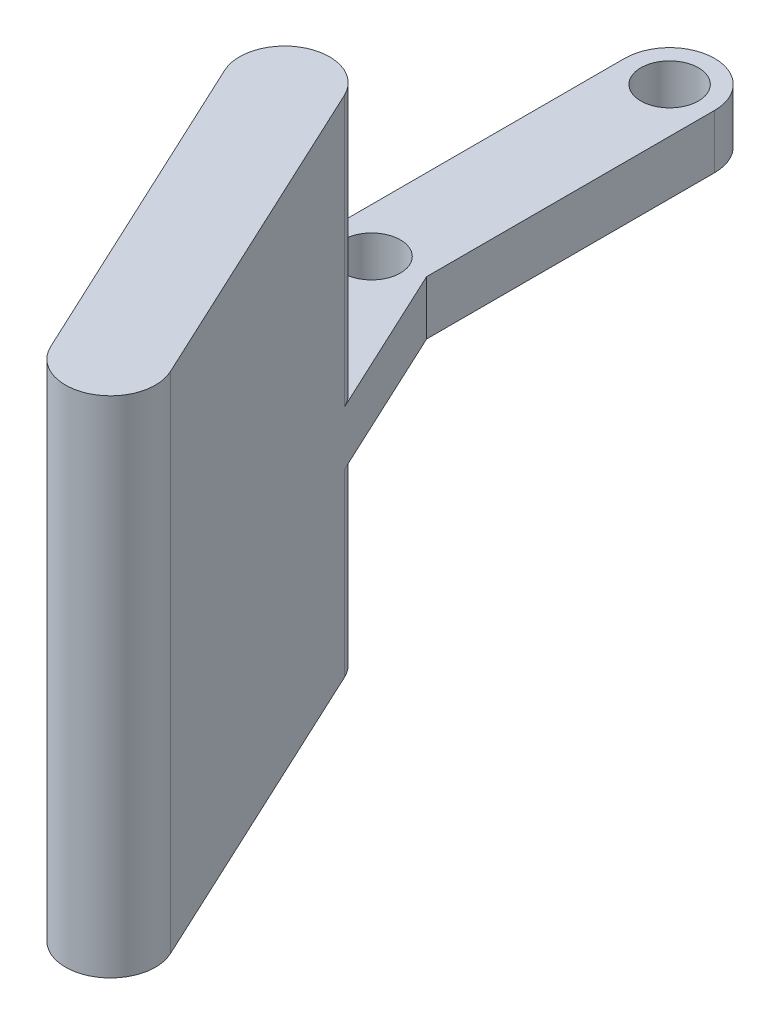
ISO-10303-21;
HEADER;
FILE_DESCRIPTION(('STEP AP214'),'2;1');
FILE_NAME('part.step','',(''),(''),'','','');
FILE_SCHEMA(('AUTOMOTIVE_DESIGN { 1 0 10303 214 1 1 1 1 }'));
ENDSEC;
DATA;
#1=APPLICATION_CONTEXT('core data for automotive mechanical design processes');
#2=APPLICATION_PROTOCOL_DEFINITION('international standard','automotive_design',2000,#1);
#3=PRODUCT_CONTEXT('',#1,'mechanical');
#4=PRODUCT('Part','Part','',(#3));
#5=PRODUCT_RELATED_PRODUCT_CATEGORY('part','',(#4));
#6=PRODUCT_DEFINITION_FORMATION('','',#4);
#7=PRODUCT_DEFINITION_CONTEXT('part definition',#1,'design');
#8=PRODUCT_DEFINITION('design','',#6,#7);
#9=PRODUCT_DEFINITION_SHAPE('','',#8);
#10=(LENGTH_UNIT() NAMED_UNIT(*) SI_UNIT(.MILLI.,.METRE.));
#11=(NAMED_UNIT(*) PLANE_ANGLE_UNIT() SI_UNIT($,.RADIAN.));
#12=(NAMED_UNIT(*) SI_UNIT($,.STERADIAN.) SOLID_ANGLE_UNIT());
#13=UNCERTAINTY_MEASURE_WITH_UNIT(LENGTH_MEASURE(1.E-05),#10,'distance_accuracy_value','');
#14=(GEOMETRIC_REPRESENTATION_CONTEXT(3) GLOBAL_UNCERTAINTY_ASSIGNED_CONTEXT((#13)) GLOBAL_UNIT_ASSIGNED_CONTEXT((#10,
#11,#12)) REPRESENTATION_CONTEXT('',''));
#15=CARTESIAN_POINT('',(0.,0.,0.));
#16=DIRECTION('',(0.,0.,1.));
#17=DIRECTION('',(1.,0.,0.));
#18=AXIS2_PLACEMENT_3D('',#15,#16,#17);
#19=CARTESIAN_POINT('',(0.,3.,16.5529453572468));
#20=DIRECTION('',(0.,-1.,0.));
#21=DIRECTION('',(0.,0.,-1.));
#22=AXIS2_PLACEMENT_3D('',#19,#20,#21);
#23=CYLINDRICAL_SURFACE('',#22,2.5);
#24=DIRECTION('',(0.,1.,0.));
#25=VECTOR('',#24,1.);
#26=CARTESIAN_POINT('',(-2.26545784998816,0.,17.6101590205747));
#27=LINE('',#26,#25);
#28=CARTESIAN_POINT('',(-2.26545784998816,0.,17.6101590205747));
#29=VERTEX_POINT('',#28);
#30=CARTESIAN_POINT('',(-2.26545784998816,3.,17.6101590205747));
#31=VERTEX_POINT('',#30);
#32=EDGE_CURVE('E219',#29,#31,#27,.T.);
#33=ORIENTED_EDGE('',*,*,#32,.T.);
#34=CARTESIAN_POINT('',(0.,3.,16.5529453572468));
#35=DIRECTION('',(0.,1.,0.));
#36=DIRECTION('',(0.,0.,1.));
#37=AXIS2_PLACEMENT_3D('',#34,#35,#36);
#38=CIRCLE('',#37,2.5);
#39=CARTESIAN_POINT('',(-2.5,3.,16.5529453572468));
#40=VERTEX_POINT('',#39);
#41=EDGE_CURVE('E241',#40,#31,#38,.T.);
#42=ORIENTED_EDGE('',*,*,#41,.F.);
#43=DIRECTION('',(0.,-1.,0.));
#44=VECTOR('',#43,1.);
#45=CARTESIAN_POINT('',(-2.5,3.,16.5529453572468));
#46=LINE('',#45,#44);
#47=CARTESIAN_POINT('',(-2.5,0.,16.5529453572468));
#48=VERTEX_POINT('',#47);
#49=EDGE_CURVE('E54',#40,#48,#46,.T.);
#50=ORIENTED_EDGE('',*,*,#49,.T.);
#51=CARTESIAN_POINT('',(0.,0.,16.5529453572468));
#52=DIRECTION('',(0.,1.,0.));
#53=DIRECTION('',(0.,0.,1.));
#54=AXIS2_PLACEMENT_3D('',#51,#52,#53);
#55=CIRCLE('',#54,2.5);
#56=EDGE_CURVE('E255',#48,#29,#55,.T.);
#57=ORIENTED_EDGE('',*,*,#56,.T.);
#58=EDGE_LOOP('',(#33,#42,#50,#57));
#59=FACE_BOUND('',#58,.T.);
#60=ADVANCED_FACE('F45',(#59),#23,.T.);
#61=CARTESIAN_POINT('',(0.,3.,0.));
#62=DIRECTION('',(0.,-1.,0.));
#63=DIRECTION('',(0.,0.,-1.));
#64=AXIS2_PLACEMENT_3D('',#61,#62,#63);
#65=CYLINDRICAL_SURFACE('',#64,2.5);
#66=CARTESIAN_POINT('',(0.,0.,0.));
#67=DIRECTION('',(0.,1.,0.));
#68=DIRECTION('',(0.,0.,1.));
#69=AXIS2_PLACEMENT_3D('',#66,#67,#68);
#70=CIRCLE('',#69,2.5);
#71=CARTESIAN_POINT('',(2.5,0.,0.));
#72=VERTEX_POINT('',#71);
#73=CARTESIAN_POINT('',(-2.5,0.,0.));
#74=VERTEX_POINT('',#73);
#75=EDGE_CURVE('E232',#72,#74,#70,.T.);
#76=ORIENTED_EDGE('',*,*,#75,.T.);
#77=DIRECTION('',(0.,-1.,0.));
#78=VECTOR('',#77,1.);
#79=CARTESIAN_POINT('',(-2.5,3.,0.));
#80=LINE('',#79,#78);
#81=CARTESIAN_POINT('',(-2.5,3.,0.));
#82=VERTEX_POINT('',#81);
#83=EDGE_CURVE('E11',#82,#74,#80,.T.);
#84=ORIENTED_EDGE('',*,*,#83,.F.);
#85=CARTESIAN_POINT('',(0.,3.,0.));
#86=DIRECTION('',(0.,1.,0.));
#87=DIRECTION('',(0.,0.,1.));
#88=AXIS2_PLACEMENT_3D('',#85,#86,#87);
#89=CIRCLE('',#88,2.5);
#90=CARTESIAN_POINT('',(2.5,3.,0.));
#91=VERTEX_POINT('',#90);
#92=EDGE_CURVE('E233',#91,#82,#89,.T.);
#93=ORIENTED_EDGE('',*,*,#92,.F.);
#94=DIRECTION('',(0.,-1.,0.));
#95=VECTOR('',#94,1.);
#96=CARTESIAN_POINT('',(2.5,3.,0.));
#97=LINE('',#96,#95);
#98=EDGE_CURVE('E248',#91,#72,#97,.T.);
#99=ORIENTED_EDGE('',*,*,#98,.T.);
#100=EDGE_LOOP('',(#76,#84,#93,#99));
#101=FACE_BOUND('',#100,.T.);
#102=ADVANCED_FACE('F47',(#101),#65,.T.);
#103=CARTESIAN_POINT('',(-2.5,3.,0.));
#104=DIRECTION('',(1.,0.,0.));
#105=DIRECTION('',(0.,0.,-1.));
#106=AXIS2_PLACEMENT_3D('',#103,#104,#105);
#107=PLANE('',#106);
#108=DIRECTION('',(0.,0.,1.));
#109=VECTOR('',#108,1.);
#110=CARTESIAN_POINT('',(-2.5,0.,0.));
#111=LINE('',#110,#109);
#112=EDGE_CURVE('E252',#74,#48,#111,.T.);
#113=ORIENTED_EDGE('',*,*,#112,.T.);
#114=ORIENTED_EDGE('',*,*,#49,.F.);
#115=DIRECTION('',(0.,0.,1.));
#116=VECTOR('',#115,1.);
#117=CARTESIAN_POINT('',(-2.5,3.,0.));
#118=LINE('',#117,#116);
#119=EDGE_CURVE('E237',#82,#40,#118,.T.);
#120=ORIENTED_EDGE('',*,*,#119,.F.);
#121=ORIENTED_EDGE('',*,*,#83,.T.);
#122=EDGE_LOOP('',(#113,#114,#120,#121));
#123=FACE_BOUND('',#122,.T.);
#124=ADVANCED_FACE('F302',(#123),#107,.F.);
#125=CARTESIAN_POINT('',(2.5,3.,0.));
#126=DIRECTION('',(-1.,0.,0.));
#127=DIRECTION('',(0.,0.,1.));
#128=AXIS2_PLACEMENT_3D('',#125,#126,#127);
#129=PLANE('',#128);
#130=DIRECTION('',(0.,0.,-1.));
#131=VECTOR('',#130,1.);
#132=CARTESIAN_POINT('',(2.5,3.,0.));
#133=LINE('',#132,#131);
#134=CARTESIAN_POINT('',(2.5,3.,15.998322015373));
#135=VERTEX_POINT('',#134);
#136=EDGE_CURVE('E245',#135,#91,#133,.T.);
#137=ORIENTED_EDGE('',*,*,#136,.F.);
#138=DIRECTION('',(0.,-1.,0.));
#139=VECTOR('',#138,1.);
#140=CARTESIAN_POINT('',(2.5,3.,15.998322015373));
#141=LINE('',#140,#139);
#142=CARTESIAN_POINT('',(2.5,0.,15.998322015373));
#143=VERTEX_POINT('',#142);
#144=EDGE_CURVE('E141',#135,#143,#141,.T.);
#145=ORIENTED_EDGE('',*,*,#144,.T.);
#146=DIRECTION('',(0.,0.,-1.));
#147=VECTOR('',#146,1.);
#148=CARTESIAN_POINT('',(2.5,0.,0.));
#149=LINE('',#148,#147);
#150=EDGE_CURVE('E238',#143,#72,#149,.T.);
#151=ORIENTED_EDGE('',*,*,#150,.T.);
#152=ORIENTED_EDGE('',*,*,#98,.F.);
#153=EDGE_LOOP('',(#137,#145,#151,#152));
#154=FACE_BOUND('',#153,.T.);
#155=ADVANCED_FACE('F305',(#154),#129,.F.);
#156=CARTESIAN_POINT('',(0.,3.,0.));
#157=DIRECTION('',(0.,1.,0.));
#158=DIRECTION('',(0.,0.,1.));
#159=AXIS2_PLACEMENT_3D('',#156,#157,#158);
#160=PLANE('',#159);
#161=CARTESIAN_POINT('',(4.22885465331121,3.,25.6147767571995));
#162=DIRECTION('',(0.,1.,0.));
#163=DIRECTION('',(0.,0.,1.));
#164=AXIS2_PLACEMENT_3D('',#161,#162,#163);
#165=CIRCLE('',#164,2.5);
#166=CARTESIAN_POINT('',(6.49431250329938,3.,24.5575630938717));
#167=VERTEX_POINT('',#166);
#168=CARTESIAN_POINT('',(1.96339680332305,3.,26.6719904205273));
#169=VERTEX_POINT('',#168);
#170=EDGE_CURVE('E61',#167,#169,#165,.T.);
#171=ORIENTED_EDGE('',*,*,#170,.F.);
#172=DIRECTION('',(-0.422885465331122,0.,-0.906183139995267));
#173=VECTOR('',#172,1.);
#174=CARTESIAN_POINT('',(2.26545784998817,3.,15.495731693919));
#175=LINE('',#174,#173);
#176=EDGE_CURVE('E216',#167,#135,#175,.T.);
#177=ORIENTED_EDGE('',*,*,#176,.T.);
#178=ORIENTED_EDGE('',*,*,#136,.T.);
#179=ORIENTED_EDGE('',*,*,#92,.T.);
#180=ORIENTED_EDGE('',*,*,#119,.T.);
#181=ORIENTED_EDGE('',*,*,#41,.T.);
#182=DIRECTION('',(0.422885465331122,0.,0.906183139995267));
#183=VECTOR('',#182,1.);
#184=CARTESIAN_POINT('',(-2.26545784998816,3.,17.6101590205747));
#185=LINE('',#184,#183);
#186=EDGE_CURVE('E200',#31,#169,#185,.T.);
#187=ORIENTED_EDGE('',*,*,#186,.T.);
#188=EDGE_LOOP('',(#171,#177,#178,#179,#180,#181,#187));
#189=FACE_BOUND('',#188,.T.);
#190=CARTESIAN_POINT('',(0.,3.,0.));
#191=DIRECTION('',(0.,1.,0.));
#192=DIRECTION('',(0.,0.,1.));
#193=AXIS2_PLACEMENT_3D('',#190,#191,#192);
#194=CIRCLE('',#193,1.6);
#195=CARTESIAN_POINT('',(0.,3.,1.6));
#196=VERTEX_POINT('',#195);
#197=EDGE_CURVE('E201',#196,#196,#194,.T.);
#198=ORIENTED_EDGE('',*,*,#197,.F.);
#199=EDGE_LOOP('',(#198));
#200=FACE_BOUND('',#199,.T.);
#201=CARTESIAN_POINT('',(0.,3.,16.5529453572468));
#202=DIRECTION('',(0.,1.,0.));
#203=DIRECTION('',(0.,0.,1.));
#204=AXIS2_PLACEMENT_3D('',#201,#202,#203);
#205=CIRCLE('',#204,1.6);
#206=CARTESIAN_POINT('',(0.,3.,18.1529453572468));
#207=VERTEX_POINT('',#206);
#208=EDGE_CURVE('E205',#207,#207,#205,.T.);
#209=ORIENTED_EDGE('',*,*,#208,.F.);
#210=EDGE_LOOP('',(#209));
#211=FACE_BOUND('',#210,.T.);
#212=ADVANCED_FACE('F309',(#189,#200,#211),#160,.T.);
#213=CARTESIAN_POINT('',(0.,0.,0.));
#214=DIRECTION('',(0.,1.,0.));
#215=DIRECTION('',(0.,0.,1.));
#216=AXIS2_PLACEMENT_3D('',#213,#214,#215);
#217=PLANE('',#216);
#218=CARTESIAN_POINT('',(4.22885465271009,0.,25.61477675748));
#219=DIRECTION('',(0.,-1.,0.));
#220=DIRECTION('',(0.,0.,-1.));
#221=AXIS2_PLACEMENT_3D('',#218,#219,#220);
#222=CIRCLE('',#221,2.49999999999999);
#223=CARTESIAN_POINT('',(1.96339680332305,0.,26.6719904205273));
#224=VERTEX_POINT('',#223);
#225=CARTESIAN_POINT('',(6.49431250266319,0.,24.5575630940771));
#226=VERTEX_POINT('',#225);
#227=EDGE_CURVE('E69',#224,#226,#222,.T.);
#228=ORIENTED_EDGE('',*,*,#227,.F.);
#229=DIRECTION('',(0.422885465331122,0.,0.906183139995267));
#230=VECTOR('',#229,1.);
#231=CARTESIAN_POINT('',(-2.26545784998816,0.,17.6101590205747));
#232=LINE('',#231,#230);
#233=EDGE_CURVE('E212',#29,#224,#232,.T.);
#234=ORIENTED_EDGE('',*,*,#233,.F.);
#235=ORIENTED_EDGE('',*,*,#56,.F.);
#236=ORIENTED_EDGE('',*,*,#112,.F.);
#237=ORIENTED_EDGE('',*,*,#75,.F.);
#238=ORIENTED_EDGE('',*,*,#150,.F.);
#239=DIRECTION('',(-0.422885465331122,0.,-0.906183139995267));
#240=VECTOR('',#239,1.);
#241=CARTESIAN_POINT('',(2.26545784998817,0.,15.495731693919));
#242=LINE('',#241,#240);
#243=EDGE_CURVE('E215',#226,#143,#242,.T.);
#244=ORIENTED_EDGE('',*,*,#243,.F.);
#245=EDGE_LOOP('',(#228,#234,#235,#236,#237,#238,#244));
#246=FACE_BOUND('',#245,.T.);
#247=CARTESIAN_POINT('',(0.,0.,0.));
#248=DIRECTION('',(0.,1.,0.));
#249=DIRECTION('',(0.,0.,1.));
#250=AXIS2_PLACEMENT_3D('',#247,#248,#249);
#251=CIRCLE('',#250,1.6);
#252=CARTESIAN_POINT('',(0.,0.,1.6));
#253=VERTEX_POINT('',#252);
#254=EDGE_CURVE('E196',#253,#253,#251,.T.);
#255=ORIENTED_EDGE('',*,*,#254,.T.);
#256=EDGE_LOOP('',(#255));
#257=FACE_BOUND('',#256,.T.);
#258=CARTESIAN_POINT('',(0.,0.,16.5529453572468));
#259=DIRECTION('',(0.,1.,0.));
#260=DIRECTION('',(0.,0.,1.));
#261=AXIS2_PLACEMENT_3D('',#258,#259,#260);
#262=CIRCLE('',#261,1.6);
#263=CARTESIAN_POINT('',(0.,0.,18.1529453572468));
#264=VERTEX_POINT('',#263);
#265=EDGE_CURVE('E195',#264,#264,#262,.T.);
#266=ORIENTED_EDGE('',*,*,#265,.T.);
#267=EDGE_LOOP('',(#266));
#268=FACE_BOUND('',#267,.T.);
#269=ADVANCED_FACE('F270',(#246,#257,#268),#217,.F.);
#270=CARTESIAN_POINT('',(2.26545784998817,0.,15.495731693919));
#271=DIRECTION('',(0.906183139995266,0.,-0.422885465331121));
#272=DIRECTION('',(-0.422885465331122,0.,-0.906183139995267));
#273=AXIS2_PLACEMENT_3D('',#270,#271,#272);
#274=PLANE('',#273);
#275=ORIENTED_EDGE('',*,*,#144,.F.);
#276=ORIENTED_EDGE('',*,*,#176,.F.);
#277=DIRECTION('',(0.,-1.,0.));
#278=VECTOR('',#277,1.);
#279=CARTESIAN_POINT('',(6.49431250329938,18.,24.5575630938717));
#280=LINE('',#279,#278);
#281=CARTESIAN_POINT('',(6.49431250329938,18.,24.5575630938717));
#282=VERTEX_POINT('',#281);
#283=EDGE_CURVE('E149',#282,#167,#280,.T.);
#284=ORIENTED_EDGE('',*,*,#283,.F.);
#285=DIRECTION('',(-0.422885465331121,0.,-0.906183139995267));
#286=VECTOR('',#285,1.);
#287=CARTESIAN_POINT('',(14.9520218099218,18.,42.681225893777));
#288=LINE('',#287,#286);
#289=CARTESIAN_POINT('',(14.9520218099218,18.,42.681225893777));
#290=VERTEX_POINT('',#289);
#291=EDGE_CURVE('E145',#290,#282,#288,.T.);
#292=ORIENTED_EDGE('',*,*,#291,.F.);
#293=DIRECTION('',(0.,1.,0.));
#294=VECTOR('',#293,1.);
#295=CARTESIAN_POINT('',(14.9520218099218,0.,42.681225893777));
#296=LINE('',#295,#294);
#297=CARTESIAN_POINT('',(14.9520218098867,-10.,42.6812258937019));
#298=VERTEX_POINT('',#297);
#299=EDGE_CURVE('E130',#298,#290,#296,.T.);
#300=ORIENTED_EDGE('',*,*,#299,.F.);
#301=DIRECTION('',(0.422885465361178,0.,0.90618313998124));
#302=VECTOR('',#301,1.);
#303=CARTESIAN_POINT('',(14.9520218098867,-10.,42.6812258937019));
#304=LINE('',#303,#302);
#305=CARTESIAN_POINT('',(6.49431250266319,-10.,24.5575630940771));
#306=VERTEX_POINT('',#305);
#307=EDGE_CURVE('E182',#306,#298,#304,.T.);
#308=ORIENTED_EDGE('',*,*,#307,.F.);
#309=DIRECTION('',(0.,1.,0.));
#310=VECTOR('',#309,1.);
#311=CARTESIAN_POINT('',(6.49431250266319,-10.,24.5575630940771));
#312=LINE('',#311,#310);
#313=EDGE_CURVE('E185',#306,#226,#312,.T.);
#314=ORIENTED_EDGE('',*,*,#313,.T.);
#315=ORIENTED_EDGE('',*,*,#243,.T.);
#316=EDGE_LOOP('',(#275,#276,#284,#292,#300,#308,#314,#315));
#317=FACE_BOUND('',#316,.T.);
#318=ADVANCED_FACE('F147',(#317),#274,.T.);
#319=CARTESIAN_POINT('',(12.6865639599336,0.,43.7384395571048));
#320=DIRECTION('',(0.,1.,0.));
#321=DIRECTION('',(0.,0.,1.));
#322=AXIS2_PLACEMENT_3D('',#319,#320,#321);
#323=CYLINDRICAL_SURFACE('',#322,2.5);
#324=ORIENTED_EDGE('',*,*,#299,.T.);
#325=CARTESIAN_POINT('',(12.6865639599336,18.,43.7384395571048));
#326=DIRECTION('',(0.,1.,0.));
#327=DIRECTION('',(0.,0.,1.));
#328=AXIS2_PLACEMENT_3D('',#325,#326,#327);
#329=CIRCLE('',#328,2.5);
#330=CARTESIAN_POINT('',(10.4211061099455,18.,44.7956532204326));
#331=VERTEX_POINT('',#330);
#332=EDGE_CURVE('E134',#331,#290,#329,.T.);
#333=ORIENTED_EDGE('',*,*,#332,.F.);
#334=DIRECTION('',(0.,1.,0.));
#335=VECTOR('',#334,1.);
#336=CARTESIAN_POINT('',(10.4211061099455,0.,44.7956532204326));
#337=LINE('',#336,#335);
#338=CARTESIAN_POINT('',(10.4211061099805,-10.,44.7956532205078));
#339=VERTEX_POINT('',#338);
#340=EDGE_CURVE('E142',#339,#331,#337,.T.);
#341=ORIENTED_EDGE('',*,*,#340,.F.);
#342=CARTESIAN_POINT('',(12.6865639599336,-10.,43.7384395571048));
#343=DIRECTION('',(0.,-1.,0.));
#344=DIRECTION('',(0.,0.,-1.));
#345=AXIS2_PLACEMENT_3D('',#342,#343,#344);
#346=CIRCLE('',#345,2.5);
#347=EDGE_CURVE('E136',#298,#339,#346,.T.);
#348=ORIENTED_EDGE('',*,*,#347,.F.);
#349=EDGE_LOOP('',(#324,#333,#341,#348));
#350=FACE_BOUND('',#349,.T.);
#351=ADVANCED_FACE('F132',(#350),#323,.T.);
#352=CARTESIAN_POINT('',(-2.26545784998816,0.,17.6101590205747));
#353=DIRECTION('',(-0.906183139995266,0.,0.422885465331121));
#354=DIRECTION('',(0.422885465331122,0.,0.906183139995267));
#355=AXIS2_PLACEMENT_3D('',#352,#353,#354);
#356=PLANE('',#355);
#357=ORIENTED_EDGE('',*,*,#186,.F.);
#358=ORIENTED_EDGE('',*,*,#32,.F.);
#359=ORIENTED_EDGE('',*,*,#233,.T.);
#360=DIRECTION('',(0.,1.,0.));
#361=VECTOR('',#360,1.);
#362=CARTESIAN_POINT('',(1.963396802757,-10.,26.671990420883));
#363=LINE('',#362,#361);
#364=CARTESIAN_POINT('',(1.963396802757,-10.,26.671990420883));
#365=VERTEX_POINT('',#364);
#366=EDGE_CURVE('E191',#365,#224,#363,.T.);
#367=ORIENTED_EDGE('',*,*,#366,.F.);
#368=DIRECTION('',(-0.422885465361177,0.,-0.90618313998124));
#369=VECTOR('',#368,1.);
#370=CARTESIAN_POINT('',(10.4211061099805,-10.,44.7956532205078));
#371=LINE('',#370,#369);
#372=EDGE_CURVE('E176',#339,#365,#371,.T.);
#373=ORIENTED_EDGE('',*,*,#372,.F.);
#374=ORIENTED_EDGE('',*,*,#340,.T.);
#375=DIRECTION('',(0.422885465331122,0.,0.906183139995266));
#376=VECTOR('',#375,1.);
#377=CARTESIAN_POINT('',(10.4211061099455,18.,44.7956532204326));
#378=LINE('',#377,#376);
#379=CARTESIAN_POINT('',(1.96339680332305,18.,26.6719904205273));
#380=VERTEX_POINT('',#379);
#381=EDGE_CURVE('E158',#380,#331,#378,.T.);
#382=ORIENTED_EDGE('',*,*,#381,.F.);
#383=DIRECTION('',(0.,-1.,0.));
#384=VECTOR('',#383,1.);
#385=CARTESIAN_POINT('',(1.96339680332305,18.,26.6719904205273));
#386=LINE('',#385,#384);
#387=EDGE_CURVE('E167',#380,#169,#386,.T.);
#388=ORIENTED_EDGE('',*,*,#387,.T.);
#389=EDGE_LOOP('',(#357,#358,#359,#367,#373,#374,#382,#388));
#390=FACE_BOUND('',#389,.T.);
#391=ADVANCED_FACE('F275',(#390),#356,.T.);
#392=CARTESIAN_POINT('',(0.,0.,16.5529453572468));
#393=DIRECTION('',(0.,1.,0.));
#394=DIRECTION('',(0.,0.,1.));
#395=AXIS2_PLACEMENT_3D('',#392,#393,#394);
#396=CYLINDRICAL_SURFACE('',#395,1.6);
#397=ORIENTED_EDGE('',*,*,#265,.F.);
#398=EDGE_LOOP('',(#397));
#399=FACE_BOUND('',#398,.T.);
#400=ORIENTED_EDGE('',*,*,#208,.T.);
#401=EDGE_LOOP('',(#400));
#402=FACE_BOUND('',#401,.T.);
#403=ADVANCED_FACE('F323',(#399,#402),#396,.F.);
#404=CARTESIAN_POINT('',(0.,0.,0.));
#405=DIRECTION('',(0.,1.,0.));
#406=DIRECTION('',(0.,0.,1.));
#407=AXIS2_PLACEMENT_3D('',#404,#405,#406);
#408=CYLINDRICAL_SURFACE('',#407,1.6);
#409=ORIENTED_EDGE('',*,*,#254,.F.);
#410=EDGE_LOOP('',(#409));
#411=FACE_BOUND('',#410,.T.);
#412=ORIENTED_EDGE('',*,*,#197,.T.);
#413=EDGE_LOOP('',(#412));
#414=FACE_BOUND('',#413,.T.);
#415=ADVANCED_FACE('F325',(#411,#414),#408,.F.);
#416=CARTESIAN_POINT('',(4.22885465271009,-10.,25.61477675748));
#417=DIRECTION('',(0.,1.,0.));
#418=DIRECTION('',(0.,0.,1.));
#419=AXIS2_PLACEMENT_3D('',#416,#417,#418);
#420=CYLINDRICAL_SURFACE('',#419,2.49999999999999);
#421=ORIENTED_EDGE('',*,*,#227,.T.);
#422=ORIENTED_EDGE('',*,*,#313,.F.);
#423=CARTESIAN_POINT('',(4.22885465271009,-10.,25.61477675748));
#424=DIRECTION('',(0.,-1.,0.));
#425=DIRECTION('',(0.,0.,-1.));
#426=AXIS2_PLACEMENT_3D('',#423,#424,#425);
#427=CIRCLE('',#426,2.49999999999999);
#428=EDGE_CURVE('E179',#365,#306,#427,.T.);
#429=ORIENTED_EDGE('',*,*,#428,.F.);
#430=ORIENTED_EDGE('',*,*,#366,.T.);
#431=EDGE_LOOP('',(#421,#422,#429,#430));
#432=FACE_BOUND('',#431,.T.);
#433=ADVANCED_FACE('F279',(#432),#420,.T.);
#434=CARTESIAN_POINT('',(12.6865639599336,-10.,43.7384395571048));
#435=DIRECTION('',(0.,-1.,0.));
#436=DIRECTION('',(0.,0.,-1.));
#437=AXIS2_PLACEMENT_3D('',#434,#435,#436);
#438=PLANE('',#437);
#439=ORIENTED_EDGE('',*,*,#347,.T.);
#440=ORIENTED_EDGE('',*,*,#372,.T.);
#441=ORIENTED_EDGE('',*,*,#428,.T.);
#442=ORIENTED_EDGE('',*,*,#307,.T.);
#443=EDGE_LOOP('',(#439,#440,#441,#442));
#444=FACE_BOUND('',#443,.T.);
#445=ADVANCED_FACE('F282',(#444),#438,.T.);
#446=CARTESIAN_POINT('',(4.22885465331121,18.,25.6147767571995));
#447=DIRECTION('',(0.,-1.,0.));
#448=DIRECTION('',(0.,0.,-1.));
#449=AXIS2_PLACEMENT_3D('',#446,#447,#448);
#450=CYLINDRICAL_SURFACE('',#449,2.5);
#451=ORIENTED_EDGE('',*,*,#170,.T.);
#452=ORIENTED_EDGE('',*,*,#387,.F.);
#453=CARTESIAN_POINT('',(4.22885465331121,18.,25.6147767571995));
#454=DIRECTION('',(0.,1.,0.));
#455=DIRECTION('',(0.,0.,1.));
#456=AXIS2_PLACEMENT_3D('',#453,#454,#455);
#457=CIRCLE('',#456,2.5);
#458=EDGE_CURVE('E153',#282,#380,#457,.T.);
#459=ORIENTED_EDGE('',*,*,#458,.F.);
#460=ORIENTED_EDGE('',*,*,#283,.T.);
#461=EDGE_LOOP('',(#451,#452,#459,#460));
#462=FACE_BOUND('',#461,.T.);
#463=ADVANCED_FACE('F285',(#462),#450,.T.);
#464=CARTESIAN_POINT('',(12.6865639599336,18.,43.7384395571048));
#465=DIRECTION('',(0.,1.,0.));
#466=DIRECTION('',(0.,0.,1.));
#467=AXIS2_PLACEMENT_3D('',#464,#465,#466);
#468=PLANE('',#467);
#469=ORIENTED_EDGE('',*,*,#332,.T.);
#470=ORIENTED_EDGE('',*,*,#291,.T.);
#471=ORIENTED_EDGE('',*,*,#458,.T.);
#472=ORIENTED_EDGE('',*,*,#381,.T.);
#473=EDGE_LOOP('',(#469,#470,#471,#472));
#474=FACE_BOUND('',#473,.T.);
#475=ADVANCED_FACE('F156',(#474),#468,.T.);
#476=CLOSED_SHELL('',(#60,#102,#124,#155,#212,#269,#318,#351,#391,#403,#415,#433,#445,#463,#475));
#477=MANIFOLD_SOLID_BREP('B2',#476);
#478=ADVANCED_BREP_SHAPE_REPRESENTATION('',(#18,#477),#14);
#479=SHAPE_DEFINITION_REPRESENTATION(#9,#478);
ENDSEC;
END-ISO-10303-21;
